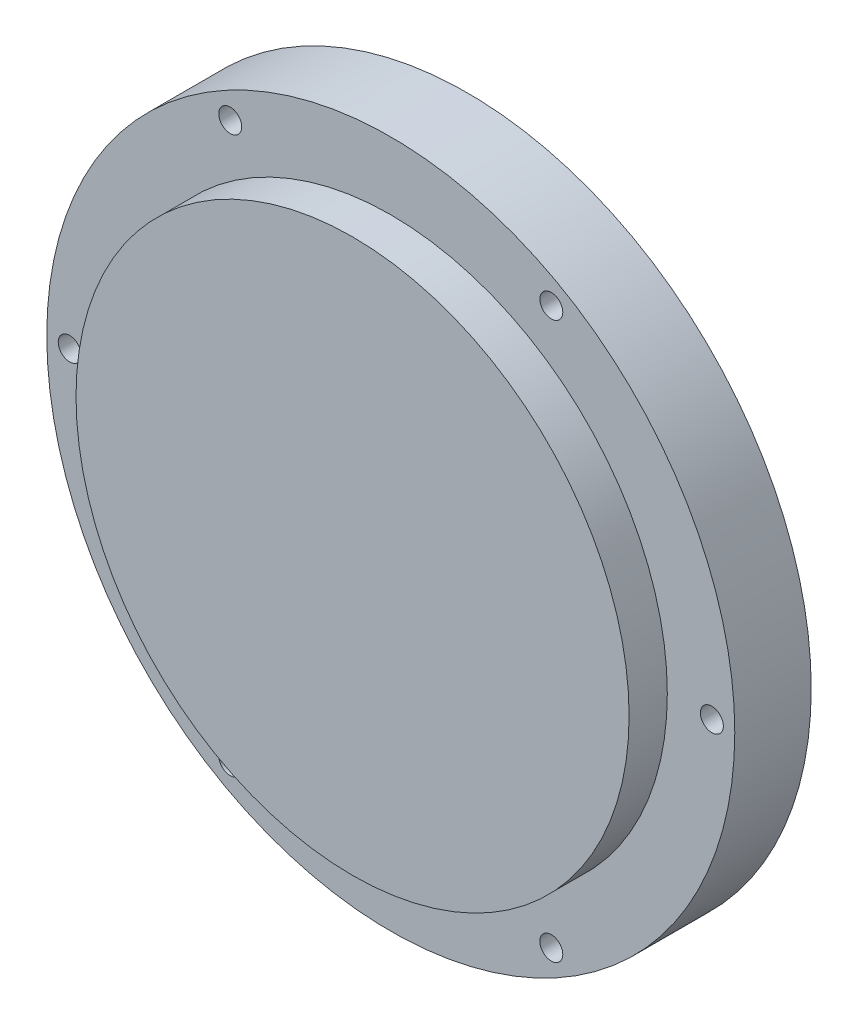
ISO-10303-21;
HEADER;
FILE_DESCRIPTION(('STEP AP214'),'2;1');
FILE_NAME('part.step','',(''),(''),'','','');
FILE_SCHEMA(('AUTOMOTIVE_DESIGN { 1 0 10303 214 1 1 1 1 }'));
ENDSEC;
DATA;
#1=APPLICATION_CONTEXT('core data for automotive mechanical design processes');
#2=APPLICATION_PROTOCOL_DEFINITION('international standard','automotive_design',2000,#1);
#3=PRODUCT_CONTEXT('',#1,'mechanical');
#4=PRODUCT('Part','Part','',(#3));
#5=PRODUCT_RELATED_PRODUCT_CATEGORY('part','',(#4));
#6=PRODUCT_DEFINITION_FORMATION('','',#4);
#7=PRODUCT_DEFINITION_CONTEXT('part definition',#1,'design');
#8=PRODUCT_DEFINITION('design','',#6,#7);
#9=PRODUCT_DEFINITION_SHAPE('','',#8);
#10=(LENGTH_UNIT() NAMED_UNIT(*) SI_UNIT(.MILLI.,.METRE.));
#11=(NAMED_UNIT(*) PLANE_ANGLE_UNIT() SI_UNIT($,.RADIAN.));
#12=(NAMED_UNIT(*) SI_UNIT($,.STERADIAN.) SOLID_ANGLE_UNIT());
#13=UNCERTAINTY_MEASURE_WITH_UNIT(LENGTH_MEASURE(1.E-05),#10,'distance_accuracy_value','');
#14=(GEOMETRIC_REPRESENTATION_CONTEXT(3) GLOBAL_UNCERTAINTY_ASSIGNED_CONTEXT((#13)) GLOBAL_UNIT_ASSIGNED_CONTEXT((#10,
#11,#12)) REPRESENTATION_CONTEXT('',''));
#15=CARTESIAN_POINT('',(0.,0.,0.));
#16=DIRECTION('',(0.,0.,1.));
#17=DIRECTION('',(1.,0.,0.));
#18=AXIS2_PLACEMENT_3D('',#15,#16,#17);
#19=CARTESIAN_POINT('',(0.,0.,5.));
#20=DIRECTION('',(0.,0.,-1.));
#21=DIRECTION('',(-1.,0.,0.));
#22=AXIS2_PLACEMENT_3D('',#19,#20,#21);
#23=CYLINDRICAL_SURFACE('',#22,45.);
#24=CARTESIAN_POINT('',(0.,0.,5.));
#25=DIRECTION('',(0.,0.,1.));
#26=DIRECTION('',(1.,0.,0.));
#27=AXIS2_PLACEMENT_3D('',#24,#25,#26);
#28=CIRCLE('',#27,45.);
#29=CARTESIAN_POINT('',(45.,0.,5.));
#30=VERTEX_POINT('',#29);
#31=EDGE_CURVE('E10',#30,#30,#28,.T.);
#32=ORIENTED_EDGE('',*,*,#31,.F.);
#33=EDGE_LOOP('',(#32));
#34=FACE_BOUND('',#33,.T.);
#35=CARTESIAN_POINT('',(0.,0.,-5.));
#36=DIRECTION('',(0.,0.,1.));
#37=DIRECTION('',(1.,0.,0.));
#38=AXIS2_PLACEMENT_3D('',#35,#36,#37);
#39=CIRCLE('',#38,45.);
#40=CARTESIAN_POINT('',(45.,0.,-5.));
#41=VERTEX_POINT('',#40);
#42=EDGE_CURVE('E53',#41,#41,#39,.T.);
#43=ORIENTED_EDGE('',*,*,#42,.T.);
#44=EDGE_LOOP('',(#43));
#45=FACE_BOUND('',#44,.T.);
#46=ADVANCED_FACE('F45',(#34,#45),#23,.T.);
#47=CARTESIAN_POINT('',(0.,0.,5.));
#48=DIRECTION('',(0.,0.,1.));
#49=DIRECTION('',(1.,0.,0.));
#50=AXIS2_PLACEMENT_3D('',#47,#48,#49);
#51=PLANE('',#50);
#52=CARTESIAN_POINT('',(42.,0.,5.));
#53=DIRECTION('',(0.,0.,1.));
#54=DIRECTION('',(1.,0.,0.));
#55=AXIS2_PLACEMENT_3D('',#52,#53,#54);
#56=CIRCLE('',#55,1.5);
#57=CARTESIAN_POINT('',(43.5,0.,5.));
#58=VERTEX_POINT('',#57);
#59=EDGE_CURVE('E64',#58,#58,#56,.T.);
#60=ORIENTED_EDGE('',*,*,#59,.F.);
#61=EDGE_LOOP('',(#60));
#62=FACE_BOUND('',#61,.T.);
#63=CARTESIAN_POINT('',(21.0000000000004,-36.3730669589462,5.));
#64=DIRECTION('',(0.,0.,1.));
#65=DIRECTION('',(1.,0.,0.));
#66=AXIS2_PLACEMENT_3D('',#63,#64,#65);
#67=CIRCLE('',#66,1.50000000000001);
#68=CARTESIAN_POINT('',(22.5000000000004,-36.3730669589462,5.));
#69=VERTEX_POINT('',#68);
#70=EDGE_CURVE('E68',#69,#69,#67,.T.);
#71=ORIENTED_EDGE('',*,*,#70,.F.);
#72=EDGE_LOOP('',(#71));
#73=FACE_BOUND('',#72,.T.);
#74=CARTESIAN_POINT('',(-20.9999999999997,-36.3730669589466,5.));
#75=DIRECTION('',(0.,0.,1.));
#76=DIRECTION('',(1.,0.,0.));
#77=AXIS2_PLACEMENT_3D('',#74,#75,#76);
#78=CIRCLE('',#77,1.50000000000001);
#79=CARTESIAN_POINT('',(-19.4999999999997,-36.3730669589466,5.));
#80=VERTEX_POINT('',#79);
#81=EDGE_CURVE('E72',#80,#80,#78,.T.);
#82=ORIENTED_EDGE('',*,*,#81,.F.);
#83=EDGE_LOOP('',(#82));
#84=FACE_BOUND('',#83,.T.);
#85=CARTESIAN_POINT('',(-42.,-2.93284432462823E-13,5.));
#86=DIRECTION('',(0.,0.,1.));
#87=DIRECTION('',(1.,0.,0.));
#88=AXIS2_PLACEMENT_3D('',#85,#86,#87);
#89=CIRCLE('',#88,1.5);
#90=CARTESIAN_POINT('',(-40.5,-2.93284432462823E-13,5.));
#91=VERTEX_POINT('',#90);
#92=EDGE_CURVE('E76',#91,#91,#89,.T.);
#93=ORIENTED_EDGE('',*,*,#92,.F.);
#94=EDGE_LOOP('',(#93));
#95=FACE_BOUND('',#94,.T.);
#96=CARTESIAN_POINT('',(-21.0000000000002,36.3730669589463,5.));
#97=DIRECTION('',(0.,0.,1.));
#98=DIRECTION('',(1.,0.,0.));
#99=AXIS2_PLACEMENT_3D('',#96,#97,#98);
#100=CIRCLE('',#99,1.5);
#101=CARTESIAN_POINT('',(-19.5000000000002,36.3730669589463,5.));
#102=VERTEX_POINT('',#101);
#103=EDGE_CURVE('E80',#102,#102,#100,.T.);
#104=ORIENTED_EDGE('',*,*,#103,.F.);
#105=EDGE_LOOP('',(#104));
#106=FACE_BOUND('',#105,.T.);
#107=CARTESIAN_POINT('',(20.9999999999999,36.3730669589465,5.));
#108=DIRECTION('',(0.,0.,1.));
#109=DIRECTION('',(1.,0.,0.));
#110=AXIS2_PLACEMENT_3D('',#107,#108,#109);
#111=CIRCLE('',#110,1.5);
#112=CARTESIAN_POINT('',(22.4999999999999,36.3730669589465,5.));
#113=VERTEX_POINT('',#112);
#114=EDGE_CURVE('E84',#113,#113,#111,.T.);
#115=ORIENTED_EDGE('',*,*,#114,.F.);
#116=EDGE_LOOP('',(#115));
#117=FACE_BOUND('',#116,.T.);
#118=CARTESIAN_POINT('',(0.,0.,5.));
#119=DIRECTION('',(0.,0.,1.));
#120=DIRECTION('',(1.,0.,0.));
#121=AXIS2_PLACEMENT_3D('',#118,#119,#120);
#122=CIRCLE('',#121,36.175);
#123=CARTESIAN_POINT('',(36.175,0.,5.));
#124=VERTEX_POINT('',#123);
#125=EDGE_CURVE('E48',#124,#124,#122,.F.);
#126=ORIENTED_EDGE('',*,*,#125,.T.);
#127=EDGE_LOOP('',(#126));
#128=FACE_BOUND('',#127,.T.);
#129=ORIENTED_EDGE('',*,*,#31,.T.);
#130=EDGE_LOOP('',(#129));
#131=FACE_BOUND('',#130,.T.);
#132=ADVANCED_FACE('F119',(#62,#73,#84,#95,#106,#117,#128,#131),#51,.T.);
#133=CARTESIAN_POINT('',(0.,0.,-5.));
#134=DIRECTION('',(0.,0.,1.));
#135=DIRECTION('',(1.,0.,0.));
#136=AXIS2_PLACEMENT_3D('',#133,#134,#135);
#137=PLANE('',#136);
#138=CARTESIAN_POINT('',(42.,0.,-5.));
#139=DIRECTION('',(0.,0.,-1.));
#140=DIRECTION('',(-1.,0.,0.));
#141=AXIS2_PLACEMENT_3D('',#138,#139,#140);
#142=CIRCLE('',#141,1.5);
#143=CARTESIAN_POINT('',(40.5,0.,-5.));
#144=VERTEX_POINT('',#143);
#145=EDGE_CURVE('E88',#144,#144,#142,.T.);
#146=ORIENTED_EDGE('',*,*,#145,.F.);
#147=EDGE_LOOP('',(#146));
#148=FACE_BOUND('',#147,.T.);
#149=CARTESIAN_POINT('',(21.0000000000004,-36.3730669589462,-5.));
#150=DIRECTION('',(0.,0.,-1.));
#151=DIRECTION('',(-1.,0.,0.));
#152=AXIS2_PLACEMENT_3D('',#149,#150,#151);
#153=CIRCLE('',#152,1.50000000000001);
#154=CARTESIAN_POINT('',(19.5000000000004,-36.3730669589462,-5.));
#155=VERTEX_POINT('',#154);
#156=EDGE_CURVE('E94',#155,#155,#153,.T.);
#157=ORIENTED_EDGE('',*,*,#156,.F.);
#158=EDGE_LOOP('',(#157));
#159=FACE_BOUND('',#158,.T.);
#160=CARTESIAN_POINT('',(-20.9999999999997,-36.3730669589466,-5.));
#161=DIRECTION('',(0.,0.,-1.));
#162=DIRECTION('',(-1.,0.,0.));
#163=AXIS2_PLACEMENT_3D('',#160,#161,#162);
#164=CIRCLE('',#163,1.50000000000001);
#165=CARTESIAN_POINT('',(-22.4999999999997,-36.3730669589466,-5.));
#166=VERTEX_POINT('',#165);
#167=EDGE_CURVE('E89',#166,#166,#164,.T.);
#168=ORIENTED_EDGE('',*,*,#167,.F.);
#169=EDGE_LOOP('',(#168));
#170=FACE_BOUND('',#169,.T.);
#171=CARTESIAN_POINT('',(-42.,-2.93284432462823E-13,-5.));
#172=DIRECTION('',(0.,0.,-1.));
#173=DIRECTION('',(-1.,0.,0.));
#174=AXIS2_PLACEMENT_3D('',#171,#172,#173);
#175=CIRCLE('',#174,1.5);
#176=CARTESIAN_POINT('',(-43.5,-2.93284432462823E-13,-5.));
#177=VERTEX_POINT('',#176);
#178=EDGE_CURVE('E93',#177,#177,#175,.T.);
#179=ORIENTED_EDGE('',*,*,#178,.F.);
#180=EDGE_LOOP('',(#179));
#181=FACE_BOUND('',#180,.T.);
#182=CARTESIAN_POINT('',(-21.0000000000002,36.3730669589463,-5.));
#183=DIRECTION('',(0.,0.,-1.));
#184=DIRECTION('',(-1.,0.,0.));
#185=AXIS2_PLACEMENT_3D('',#182,#183,#184);
#186=CIRCLE('',#185,1.5);
#187=CARTESIAN_POINT('',(-22.5000000000002,36.3730669589463,-5.));
#188=VERTEX_POINT('',#187);
#189=EDGE_CURVE('E98',#188,#188,#186,.T.);
#190=ORIENTED_EDGE('',*,*,#189,.F.);
#191=EDGE_LOOP('',(#190));
#192=FACE_BOUND('',#191,.T.);
#193=CARTESIAN_POINT('',(20.9999999999999,36.3730669589465,-5.));
#194=DIRECTION('',(0.,0.,-1.));
#195=DIRECTION('',(-1.,0.,0.));
#196=AXIS2_PLACEMENT_3D('',#193,#194,#195);
#197=CIRCLE('',#196,1.5);
#198=CARTESIAN_POINT('',(19.4999999999999,36.3730669589465,-5.));
#199=VERTEX_POINT('',#198);
#200=EDGE_CURVE('E102',#199,#199,#197,.T.);
#201=ORIENTED_EDGE('',*,*,#200,.F.);
#202=EDGE_LOOP('',(#201));
#203=FACE_BOUND('',#202,.T.);
#204=ORIENTED_EDGE('',*,*,#42,.F.);
#205=EDGE_LOOP('',(#204));
#206=FACE_BOUND('',#205,.T.);
#207=ADVANCED_FACE('F115',(#148,#159,#170,#181,#192,#203,#206),#137,.F.);
#208=CARTESIAN_POINT('',(0.,0.,10.));
#209=DIRECTION('',(0.,0.,-1.));
#210=DIRECTION('',(-1.,0.,0.));
#211=AXIS2_PLACEMENT_3D('',#208,#209,#210);
#212=CYLINDRICAL_SURFACE('',#211,36.175);
#213=ORIENTED_EDGE('',*,*,#125,.F.);
#214=EDGE_LOOP('',(#213));
#215=FACE_BOUND('',#214,.T.);
#216=CARTESIAN_POINT('',(0.,0.,10.));
#217=DIRECTION('',(0.,0.,1.));
#218=DIRECTION('',(1.,0.,0.));
#219=AXIS2_PLACEMENT_3D('',#216,#217,#218);
#220=CIRCLE('',#219,36.175);
#221=CARTESIAN_POINT('',(36.175,0.,10.));
#222=VERTEX_POINT('',#221);
#223=EDGE_CURVE('E60',#222,#222,#220,.T.);
#224=ORIENTED_EDGE('',*,*,#223,.F.);
#225=EDGE_LOOP('',(#224));
#226=FACE_BOUND('',#225,.T.);
#227=ADVANCED_FACE('F118',(#215,#226),#212,.T.);
#228=CARTESIAN_POINT('',(0.,0.,10.));
#229=DIRECTION('',(0.,0.,1.));
#230=DIRECTION('',(1.,0.,0.));
#231=AXIS2_PLACEMENT_3D('',#228,#229,#230);
#232=PLANE('',#231);
#233=ORIENTED_EDGE('',*,*,#223,.T.);
#234=EDGE_LOOP('',(#233));
#235=FACE_BOUND('',#234,.T.);
#236=ADVANCED_FACE('F147',(#235),#232,.T.);
#237=CARTESIAN_POINT('',(20.9999999999999,36.3730669589465,10.));
#238=DIRECTION('',(0.,0.,-1.));
#239=DIRECTION('',(-1.,0.,0.));
#240=AXIS2_PLACEMENT_3D('',#237,#238,#239);
#241=CYLINDRICAL_SURFACE('',#240,1.5);
#242=ORIENTED_EDGE('',*,*,#114,.T.);
#243=EDGE_LOOP('',(#242));
#244=FACE_BOUND('',#243,.T.);
#245=ORIENTED_EDGE('',*,*,#200,.T.);
#246=EDGE_LOOP('',(#245));
#247=FACE_BOUND('',#246,.T.);
#248=ADVANCED_FACE('F150',(#244,#247),#241,.F.);
#249=CARTESIAN_POINT('',(-21.0000000000002,36.3730669589463,10.));
#250=DIRECTION('',(0.,0.,-1.));
#251=DIRECTION('',(-1.,0.,0.));
#252=AXIS2_PLACEMENT_3D('',#249,#250,#251);
#253=CYLINDRICAL_SURFACE('',#252,1.5);
#254=ORIENTED_EDGE('',*,*,#103,.T.);
#255=EDGE_LOOP('',(#254));
#256=FACE_BOUND('',#255,.T.);
#257=ORIENTED_EDGE('',*,*,#189,.T.);
#258=EDGE_LOOP('',(#257));
#259=FACE_BOUND('',#258,.T.);
#260=ADVANCED_FACE('F160',(#256,#259),#253,.F.);
#261=CARTESIAN_POINT('',(-42.,-2.93284432462823E-13,10.));
#262=DIRECTION('',(0.,0.,-1.));
#263=DIRECTION('',(-1.,0.,0.));
#264=AXIS2_PLACEMENT_3D('',#261,#262,#263);
#265=CYLINDRICAL_SURFACE('',#264,1.5);
#266=ORIENTED_EDGE('',*,*,#92,.T.);
#267=EDGE_LOOP('',(#266));
#268=FACE_BOUND('',#267,.T.);
#269=ORIENTED_EDGE('',*,*,#178,.T.);
#270=EDGE_LOOP('',(#269));
#271=FACE_BOUND('',#270,.T.);
#272=ADVANCED_FACE('F156',(#268,#271),#265,.F.);
#273=CARTESIAN_POINT('',(-20.9999999999997,-36.3730669589466,10.));
#274=DIRECTION('',(0.,0.,-1.));
#275=DIRECTION('',(-1.,0.,0.));
#276=AXIS2_PLACEMENT_3D('',#273,#274,#275);
#277=CYLINDRICAL_SURFACE('',#276,1.50000000000001);
#278=ORIENTED_EDGE('',*,*,#81,.T.);
#279=EDGE_LOOP('',(#278));
#280=FACE_BOUND('',#279,.T.);
#281=ORIENTED_EDGE('',*,*,#167,.T.);
#282=EDGE_LOOP('',(#281));
#283=FACE_BOUND('',#282,.T.);
#284=ADVANCED_FACE('F152',(#280,#283),#277,.F.);
#285=CARTESIAN_POINT('',(21.0000000000004,-36.3730669589462,10.));
#286=DIRECTION('',(0.,0.,-1.));
#287=DIRECTION('',(-1.,0.,0.));
#288=AXIS2_PLACEMENT_3D('',#285,#286,#287);
#289=CYLINDRICAL_SURFACE('',#288,1.50000000000001);
#290=ORIENTED_EDGE('',*,*,#70,.T.);
#291=EDGE_LOOP('',(#290));
#292=FACE_BOUND('',#291,.T.);
#293=ORIENTED_EDGE('',*,*,#156,.T.);
#294=EDGE_LOOP('',(#293));
#295=FACE_BOUND('',#294,.T.);
#296=ADVANCED_FACE('F155',(#292,#295),#289,.F.);
#297=CARTESIAN_POINT('',(42.,0.,10.));
#298=DIRECTION('',(0.,0.,-1.));
#299=DIRECTION('',(-1.,0.,0.));
#300=AXIS2_PLACEMENT_3D('',#297,#298,#299);
#301=CYLINDRICAL_SURFACE('',#300,1.5);
#302=ORIENTED_EDGE('',*,*,#59,.T.);
#303=EDGE_LOOP('',(#302));
#304=FACE_BOUND('',#303,.T.);
#305=ORIENTED_EDGE('',*,*,#145,.T.);
#306=EDGE_LOOP('',(#305));
#307=FACE_BOUND('',#306,.T.);
#308=ADVANCED_FACE('F113',(#304,#307),#301,.F.);
#309=CLOSED_SHELL('',(#46,#132,#207,#227,#236,#248,#260,#272,#284,#296,#308));
#310=MANIFOLD_SOLID_BREP('B2',#309);
#311=ADVANCED_BREP_SHAPE_REPRESENTATION('',(#18,#310),#14);
#312=SHAPE_DEFINITION_REPRESENTATION(#9,#311);
ENDSEC;
END-ISO-10303-21;
